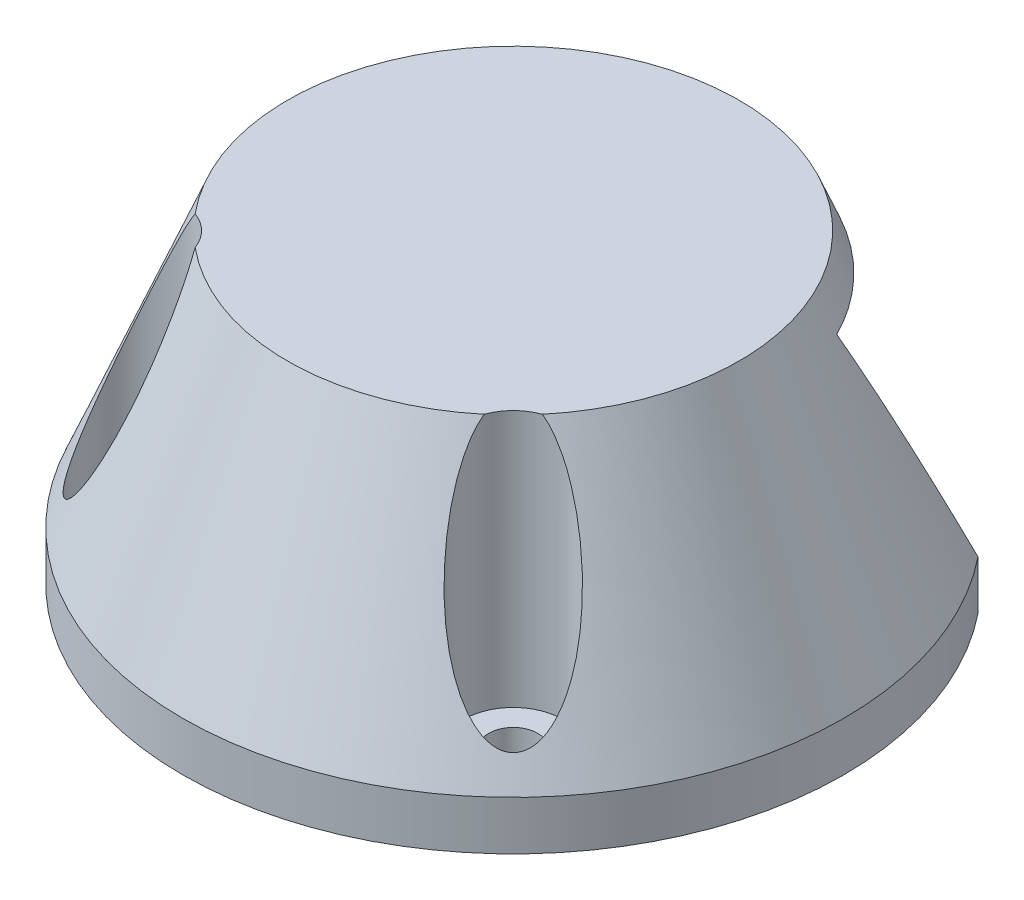
ISO-10303-21;
HEADER;
FILE_DESCRIPTION(('STEP AP214'),'2;1');
FILE_NAME('part.step','',(''),(''),'','','');
FILE_SCHEMA(('AUTOMOTIVE_DESIGN { 1 0 10303 214 1 1 1 1 }'));
ENDSEC;
DATA;
#1=APPLICATION_CONTEXT('core data for automotive mechanical design processes');
#2=APPLICATION_PROTOCOL_DEFINITION('international standard','automotive_design',2000,#1);
#3=PRODUCT_CONTEXT('',#1,'mechanical');
#4=PRODUCT('Part','Part','',(#3));
#5=PRODUCT_RELATED_PRODUCT_CATEGORY('part','',(#4));
#6=PRODUCT_DEFINITION_FORMATION('','',#4);
#7=PRODUCT_DEFINITION_CONTEXT('part definition',#1,'design');
#8=PRODUCT_DEFINITION('design','',#6,#7);
#9=PRODUCT_DEFINITION_SHAPE('','',#8);
#10=(LENGTH_UNIT() NAMED_UNIT(*) SI_UNIT(.MILLI.,.METRE.));
#11=(NAMED_UNIT(*) PLANE_ANGLE_UNIT() SI_UNIT($,.RADIAN.));
#12=(NAMED_UNIT(*) SI_UNIT($,.STERADIAN.) SOLID_ANGLE_UNIT());
#13=UNCERTAINTY_MEASURE_WITH_UNIT(LENGTH_MEASURE(1.E-05),#10,'distance_accuracy_value','');
#14=(GEOMETRIC_REPRESENTATION_CONTEXT(3) GLOBAL_UNCERTAINTY_ASSIGNED_CONTEXT((#13)) GLOBAL_UNIT_ASSIGNED_CONTEXT((#10,
#11,#12)) REPRESENTATION_CONTEXT('',''));
#15=CARTESIAN_POINT('',(0.,0.,0.));
#16=DIRECTION('',(0.,0.,1.));
#17=DIRECTION('',(1.,0.,0.));
#18=AXIS2_PLACEMENT_3D('',#15,#16,#17);
#19=CARTESIAN_POINT('',(0.,0.,0.));
#20=DIRECTION('',(0.,-1.,0.));
#21=DIRECTION('',(0.,0.,-1.));
#22=AXIS2_PLACEMENT_3D('',#19,#20,#21);
#23=PLANE('',#22);
#24=CARTESIAN_POINT('',(0.,0.,0.));
#25=DIRECTION('',(0.,-1.,0.));
#26=DIRECTION('',(0.,0.,-1.));
#27=AXIS2_PLACEMENT_3D('',#24,#25,#26);
#28=CIRCLE('',#27,27.);
#29=CARTESIAN_POINT('',(21.0484004181326,0.,-16.9104949613533));
#30=VERTEX_POINT('',#29);
#31=CARTESIAN_POINT('',(-21.0484004181331,0.,-16.9104949613526));
#32=VERTEX_POINT('',#31);
#33=EDGE_CURVE('E237',#30,#32,#28,.T.);
#34=ORIENTED_EDGE('',*,*,#33,.T.);
#35=DIRECTION('',(-0.397833436870878,0.,-0.917457659245104));
#36=VECTOR('',#35,1.);
#37=CARTESIAN_POINT('',(-16.6806410231171,0.,-6.83785164053032));
#38=LINE('',#37,#36);
#39=CARTESIAN_POINT('',(-16.6806410231171,0.,-6.83785164053032));
#40=VERTEX_POINT('',#39);
#41=EDGE_CURVE('E136',#40,#32,#38,.T.);
#42=ORIENTED_EDGE('',*,*,#41,.F.);
#43=DIRECTION('',(-0.197657340379126,0.,-0.980271174621722));
#44=VECTOR('',#43,1.);
#45=CARTESIAN_POINT('',(-14.7040676193258,0.,2.9648601056869));
#46=LINE('',#45,#44);
#47=CARTESIAN_POINT('',(-14.7040676193258,0.,2.9648601056869));
#48=VERTEX_POINT('',#47);
#49=EDGE_CURVE('E141',#48,#40,#46,.T.);
#50=ORIENTED_EDGE('',*,*,#49,.F.);
#51=CARTESIAN_POINT('',(0.,0.,0.));
#52=DIRECTION('',(0.,-1.,0.));
#53=DIRECTION('',(0.,0.,-1.));
#54=AXIS2_PLACEMENT_3D('',#51,#52,#53);
#55=CIRCLE('',#54,15.);
#56=CARTESIAN_POINT('',(14.7040676193258,0.,2.9648601056869));
#57=VERTEX_POINT('',#56);
#58=EDGE_CURVE('E203',#57,#48,#55,.T.);
#59=ORIENTED_EDGE('',*,*,#58,.F.);
#60=DIRECTION('',(-0.197657340379125,0.,0.980271174621722));
#61=VECTOR('',#60,1.);
#62=CARTESIAN_POINT('',(14.7040676193258,0.,2.9648601056869));
#63=LINE('',#62,#61);
#64=CARTESIAN_POINT('',(16.6806410231171,0.,-6.83785164053032));
#65=VERTEX_POINT('',#64);
#66=EDGE_CURVE('E139',#65,#57,#63,.T.);
#67=ORIENTED_EDGE('',*,*,#66,.F.);
#68=DIRECTION('',(-0.397833436870814,0.,0.917457659245132));
#69=VECTOR('',#68,1.);
#70=CARTESIAN_POINT('',(16.6806410231171,0.,-6.83785164053032));
#71=LINE('',#70,#69);
#72=EDGE_CURVE('E121',#30,#65,#71,.T.);
#73=ORIENTED_EDGE('',*,*,#72,.F.);
#74=EDGE_LOOP('',(#34,#42,#50,#59,#67,#73));
#75=FACE_BOUND('',#74,.T.);
#76=CARTESIAN_POINT('',(15.5563491861042,0.,15.5563491861039));
#77=DIRECTION('',(0.,1.,0.));
#78=DIRECTION('',(0.,0.,1.));
#79=AXIS2_PLACEMENT_3D('',#76,#77,#78);
#80=CIRCLE('',#79,2.);
#81=CARTESIAN_POINT('',(15.5563491861042,0.,17.5563491861039));
#82=VERTEX_POINT('',#81);
#83=EDGE_CURVE('E241',#82,#82,#80,.T.);
#84=ORIENTED_EDGE('',*,*,#83,.T.);
#85=EDGE_LOOP('',(#84));
#86=FACE_BOUND('',#85,.T.);
#87=CARTESIAN_POINT('',(-15.5563491861039,0.,15.5563491861042));
#88=DIRECTION('',(0.,1.,0.));
#89=DIRECTION('',(0.,0.,1.));
#90=AXIS2_PLACEMENT_3D('',#87,#88,#89);
#91=CIRCLE('',#90,2.);
#92=CARTESIAN_POINT('',(-15.5563491861039,0.,17.5563491861042));
#93=VERTEX_POINT('',#92);
#94=EDGE_CURVE('E244',#93,#93,#91,.T.);
#95=ORIENTED_EDGE('',*,*,#94,.T.);
#96=EDGE_LOOP('',(#95));
#97=FACE_BOUND('',#96,.T.);
#98=ADVANCED_FACE('F34',(#75,#86,#97),#23,.T.);
#99=CARTESIAN_POINT('',(0.,0.,0.));
#100=DIRECTION('',(0.,-1.,0.));
#101=DIRECTION('',(0.,0.,-1.));
#102=AXIS2_PLACEMENT_3D('',#99,#100,#101);
#103=CYLINDRICAL_SURFACE('',#102,15.);
#104=ORIENTED_EDGE('',*,*,#58,.T.);
#105=DIRECTION('',(0.,-1.,0.));
#106=VECTOR('',#105,1.);
#107=CARTESIAN_POINT('',(-14.7040676193258,22.,2.9648601056869));
#108=LINE('',#107,#106);
#109=CARTESIAN_POINT('',(-14.7040676193258,22.,2.9648601056869));
#110=VERTEX_POINT('',#109);
#111=EDGE_CURVE('E147',#110,#48,#108,.T.);
#112=ORIENTED_EDGE('',*,*,#111,.F.);
#113=CARTESIAN_POINT('',(0.,22.,0.));
#114=DIRECTION('',(0.,-1.,0.));
#115=DIRECTION('',(0.,0.,-1.));
#116=AXIS2_PLACEMENT_3D('',#113,#114,#115);
#117=CIRCLE('',#116,15.);
#118=CARTESIAN_POINT('',(14.7040676193258,22.,2.9648601056869));
#119=VERTEX_POINT('',#118);
#120=EDGE_CURVE('E258',#119,#110,#117,.T.);
#121=ORIENTED_EDGE('',*,*,#120,.F.);
#122=DIRECTION('',(0.,-1.,0.));
#123=VECTOR('',#122,1.);
#124=CARTESIAN_POINT('',(14.7040676193258,22.,2.9648601056869));
#125=LINE('',#124,#123);
#126=EDGE_CURVE('E124',#119,#57,#125,.T.);
#127=ORIENTED_EDGE('',*,*,#126,.T.);
#128=EDGE_LOOP('',(#104,#112,#121,#127));
#129=FACE_BOUND('',#128,.T.);
#130=ADVANCED_FACE('F227',(#129),#103,.F.);
#131=CARTESIAN_POINT('',(0.,22.,0.));
#132=DIRECTION('',(0.,-1.,0.));
#133=DIRECTION('',(0.,0.,-1.));
#134=AXIS2_PLACEMENT_3D('',#131,#132,#133);
#135=PLANE('',#134);
#136=ORIENTED_EDGE('',*,*,#120,.T.);
#137=DIRECTION('',(-0.197657340379126,0.,-0.980271174621722));
#138=VECTOR('',#137,1.);
#139=CARTESIAN_POINT('',(-14.7040676193258,22.,2.9648601056869));
#140=LINE('',#139,#138);
#141=CARTESIAN_POINT('',(-16.6806410231171,22.,-6.83785164053032));
#142=VERTEX_POINT('',#141);
#143=EDGE_CURVE('E129',#110,#142,#140,.T.);
#144=ORIENTED_EDGE('',*,*,#143,.T.);
#145=DIRECTION('',(-0.397833436870878,0.,-0.917457659245104));
#146=VECTOR('',#145,1.);
#147=CARTESIAN_POINT('',(-16.6806410231171,22.,-6.83785164053032));
#148=LINE('',#147,#146);
#149=CARTESIAN_POINT('',(-17.560126089436,22.,-8.86606303631576));
#150=VERTEX_POINT('',#149);
#151=EDGE_CURVE('E115',#142,#150,#148,.T.);
#152=ORIENTED_EDGE('',*,*,#151,.T.);
#153=CARTESIAN_POINT('',(0.,22.,0.));
#154=DIRECTION('',(0.,-1.,0.));
#155=DIRECTION('',(0.,0.,-1.));
#156=AXIS2_PLACEMENT_3D('',#153,#154,#155);
#157=CIRCLE('',#156,19.6714285714286);
#158=CARTESIAN_POINT('',(17.5601260894359,22.,-8.86606303631594));
#159=VERTEX_POINT('',#158);
#160=EDGE_CURVE('E11',#159,#150,#157,.F.);
#161=ORIENTED_EDGE('',*,*,#160,.F.);
#162=DIRECTION('',(-0.397833436870814,0.,0.917457659245132));
#163=VECTOR('',#162,1.);
#164=CARTESIAN_POINT('',(16.6806410231171,22.,-6.83785164053032));
#165=LINE('',#164,#163);
#166=CARTESIAN_POINT('',(16.6806410231171,22.,-6.83785164053032));
#167=VERTEX_POINT('',#166);
#168=EDGE_CURVE('E105',#159,#167,#165,.T.);
#169=ORIENTED_EDGE('',*,*,#168,.T.);
#170=DIRECTION('',(-0.197657340379125,0.,0.980271174621722));
#171=VECTOR('',#170,1.);
#172=CARTESIAN_POINT('',(14.7040676193258,22.,2.9648601056869));
#173=LINE('',#172,#171);
#174=EDGE_CURVE('E110',#167,#119,#173,.T.);
#175=ORIENTED_EDGE('',*,*,#174,.T.);
#176=EDGE_LOOP('',(#136,#144,#152,#161,#169,#175));
#177=FACE_BOUND('',#176,.T.);
#178=ADVANCED_FACE('F108',(#177),#135,.T.);
#179=CARTESIAN_POINT('',(0.,25.,0.));
#180=DIRECTION('',(0.,-1.,0.));
#181=DIRECTION('',(0.,0.,-1.));
#182=AXIS2_PLACEMENT_3D('',#179,#180,#181);
#183=PLANE('',#182);
#184=CARTESIAN_POINT('',(0.,25.,0.));
#185=DIRECTION('',(0.,-1.,0.));
#186=DIRECTION('',(0.,0.,-1.));
#187=AXIS2_PLACEMENT_3D('',#184,#185,#186);
#188=CIRCLE('',#187,18.45);
#189=CARTESIAN_POINT('',(11.7991895718498,25.,14.1838508680665));
#190=VERTEX_POINT('',#189);
#191=CARTESIAN_POINT('',(-11.7991895718495,25.,14.1838508680668));
#192=VERTEX_POINT('',#191);
#193=EDGE_CURVE('E254',#190,#192,#188,.T.);
#194=ORIENTED_EDGE('',*,*,#193,.F.);
#195=CARTESIAN_POINT('',(15.5563491861042,25.,15.5563491861039));
#196=DIRECTION('',(0.,-1.,0.));
#197=DIRECTION('',(0.,0.,-1.));
#198=AXIS2_PLACEMENT_3D('',#195,#196,#197);
#199=CIRCLE('',#198,4.);
#200=CARTESIAN_POINT('',(14.1838508680668,25.,11.7991895718494));
#201=VERTEX_POINT('',#200);
#202=EDGE_CURVE('E47',#190,#201,#199,.T.);
#203=ORIENTED_EDGE('',*,*,#202,.T.);
#204=CARTESIAN_POINT('',(-14.1838508680666,25.,11.7991895718497));
#205=VERTEX_POINT('',#204);
#206=EDGE_CURVE('E255',#205,#201,#188,.T.);
#207=ORIENTED_EDGE('',*,*,#206,.F.);
#208=CARTESIAN_POINT('',(-15.5563491861039,25.,15.5563491861042));
#209=DIRECTION('',(0.,-1.,0.));
#210=DIRECTION('',(0.,0.,-1.));
#211=AXIS2_PLACEMENT_3D('',#208,#209,#210);
#212=CIRCLE('',#211,4.);
#213=EDGE_CURVE('E54',#205,#192,#212,.T.);
#214=ORIENTED_EDGE('',*,*,#213,.T.);
#215=EDGE_LOOP('',(#194,#203,#207,#214));
#216=FACE_BOUND('',#215,.T.);
#217=ADVANCED_FACE('F224',(#216),#183,.F.);
#218=CARTESIAN_POINT('',(0.,4.,0.));
#219=DIRECTION('',(0.,-1.,0.));
#220=DIRECTION('',(0.,0.,-1.));
#221=AXIS2_PLACEMENT_3D('',#218,#219,#220);
#222=CONICAL_SURFACE('',#221,27.,0.386648806003586);
#223=CARTESIAN_POINT('',(-21.0484370327288,3.9998,-16.9105793995575));
#224=CARTESIAN_POINT('',(-20.90966295222,4.75779050962495,-16.5905476192503));
#225=CARTESIAN_POINT('',(-20.7703541536686,5.51516478625433,-16.2692827068877));
#226=CARTESIAN_POINT('',(-20.4904952904255,7.02846679813618,-15.6238903547277));
#227=CARTESIAN_POINT('',(-20.3499452200931,7.78439452679603,-15.299762901922));
#228=CARTESIAN_POINT('',(-20.0674584628859,9.29444765089693,-14.6483102712092));
#229=CARTESIAN_POINT('',(-19.925522028068,10.048573344041,-14.3209856745794));
#230=CARTESIAN_POINT('',(-19.64002188263,11.5548755147973,-13.662583763448));
#231=CARTESIAN_POINT('',(-19.4964581750168,12.3070519960083,-13.3315064558811));
#232=CARTESIAN_POINT('',(-19.2074277635495,13.8091798065888,-12.6649632742894));
#233=CARTESIAN_POINT('',(-19.0619608838517,14.5591309223794,-12.3294969947457));
#234=CARTESIAN_POINT('',(-18.7688130873676,16.0562869137664,-11.6534585669791));
#235=CARTESIAN_POINT('',(-18.621132192945,16.8034918170074,-11.3128864703301));
#236=CARTESIAN_POINT('',(-18.3231201867635,18.2947267528828,-10.6256305177668));
#237=CARTESIAN_POINT('',(-18.1727886121769,19.0387562023189,-10.2789455945092));
#238=CARTESIAN_POINT('',(-17.9449261005024,20.1517565493493,-9.75346385462612));
#239=CARTESIAN_POINT('',(-17.8685763243704,20.5222560894647,-9.57739095475893));
#240=CARTESIAN_POINT('',(-17.715004877153,21.2621148950918,-9.22323444745489));
#241=CARTESIAN_POINT('',(-17.6377831996562,21.6314741521932,-9.0451508252325));
#242=CARTESIAN_POINT('',(-17.5600839434852,22.0002,-8.86596584205849));
#243=B_SPLINE_CURVE_WITH_KNOTS('',3,(#223,#224,#225,#226,#227,#228,#229,#230,#231,#232,#233,
#234,#235,#236,#237,#238,#239,#240,#241,#242),.UNSPECIFIED.,.F.,.F.,(4,2,2,2,2,2,2,2,2,4),(0.,
2.50321049979108,5.00643238089495,7.50920731908681,10.011977633141,12.5149808469518,
15.0179587949748,17.5213781958486,18.7731335530743,20.024898120904),.UNSPECIFIED.);
#244=CARTESIAN_POINT('',(-21.0484004181331,4.,-16.9104949613526));
#245=VERTEX_POINT('',#244);
#246=EDGE_CURVE('E159',#245,#150,#243,.T.);
#247=ORIENTED_EDGE('',*,*,#246,.F.);
#248=CARTESIAN_POINT('',(0.,4.,0.));
#249=DIRECTION('',(0.,-1.,0.));
#250=DIRECTION('',(0.,0.,-1.));
#251=AXIS2_PLACEMENT_3D('',#248,#249,#250);
#252=CIRCLE('',#251,27.);
#253=CARTESIAN_POINT('',(21.0484004181326,4.,-16.9104949613533));
#254=VERTEX_POINT('',#253);
#255=EDGE_CURVE('E247',#254,#245,#252,.T.);
#256=ORIENTED_EDGE('',*,*,#255,.F.);
#257=CARTESIAN_POINT('',(17.5600839434851,22.0002,-8.86596584205867));
#258=CARTESIAN_POINT('',(17.6377831996561,21.6314741521932,-9.04515082523269));
#259=CARTESIAN_POINT('',(17.7150048771529,21.2621148950918,-9.2232344474551));
#260=CARTESIAN_POINT('',(17.8685763243702,20.5222560894647,-9.57739095475916));
#261=CARTESIAN_POINT('',(17.9449261005023,20.1517565493493,-9.75346385462637));
#262=CARTESIAN_POINT('',(18.1727886121767,19.0387562023189,-10.2789455945095));
#263=CARTESIAN_POINT('',(18.3231201867633,18.2947267528828,-10.6256305177671));
#264=CARTESIAN_POINT('',(18.6211321929448,16.8034918170074,-11.3128864703304));
#265=CARTESIAN_POINT('',(18.7688130873674,16.0562869137664,-11.6534585669795));
#266=CARTESIAN_POINT('',(19.0619608838515,14.5591309223794,-12.3294969947461));
#267=CARTESIAN_POINT('',(19.2074277635492,13.8091798065889,-12.6649632742898));
#268=CARTESIAN_POINT('',(19.4964581750165,12.3070519960083,-13.3315064558816));
#269=CARTESIAN_POINT('',(19.6400218826296,11.5548755147973,-13.6625837634485));
#270=CARTESIAN_POINT('',(19.9255220280676,10.048573344041,-14.3209856745799));
#271=CARTESIAN_POINT('',(20.0674584628855,9.29444765089694,-14.6483102712097));
#272=CARTESIAN_POINT('',(20.3499452200926,7.78439452679604,-15.2997629019226));
#273=CARTESIAN_POINT('',(20.490495290425,7.02846679813619,-15.6238903547283));
#274=CARTESIAN_POINT('',(20.7703541536681,5.51516478625433,-16.2692827068883));
#275=CARTESIAN_POINT('',(20.9096629522195,4.75779050962495,-16.590547619251));
#276=CARTESIAN_POINT('',(21.0484370327283,3.9998,-16.9105793995582));
#277=B_SPLINE_CURVE_WITH_KNOTS('',3,(#257,#258,#259,#260,#261,#262,#263,#264,#265,#266,#267,
#268,#269,#270,#271,#272,#273,#274,#275,#276),.UNSPECIFIED.,.F.,.F.,(4,2,2,2,2,2,2,2,2,4),(0.,
1.25176456782978,2.50351992505549,5.00693932592922,7.50991727395225,10.0129204877631,
12.5156908018173,15.0184657400092,17.5216876211131,20.0248981209042),.UNSPECIFIED.);
#278=EDGE_CURVE('E146',#159,#254,#277,.T.);
#279=ORIENTED_EDGE('',*,*,#278,.F.);
#280=ORIENTED_EDGE('',*,*,#160,.T.);
#281=EDGE_LOOP('',(#247,#256,#279,#280));
#282=FACE_BOUND('',#281,.T.);
#283=CARTESIAN_POINT('',(11.7992451613353,25.0002,14.1836987036192));
#284=CARTESIAN_POINT('',(11.7732096159804,24.9063048770337,14.2550720073797));
#285=CARTESIAN_POINT('',(11.750033358753,24.8103909906954,14.3247051029376));
#286=CARTESIAN_POINT('',(11.7086211531663,24.6154511719495,14.4608464223805));
#287=CARTESIAN_POINT('',(11.6903808197317,24.5164280896312,14.5273573762621));
#288=CARTESIAN_POINT('',(11.6580693996079,24.316339412797,14.6575311463127));
#289=CARTESIAN_POINT('',(11.6439854096075,24.2152812026564,14.7212022448987));
#290=CARTESIAN_POINT('',(11.6193693860191,24.0112991315491,14.8462435781204));
#291=CARTESIAN_POINT('',(11.6088382804854,23.9083747905144,14.9076132078708));
#292=CARTESIAN_POINT('',(11.5820156190691,23.5986876006401,15.087921175562));
#293=CARTESIAN_POINT('',(11.5703079084718,23.3897701649573,15.2038517155131));
#294=CARTESIAN_POINT('',(11.5567791665776,22.9679515417629,15.4292508655593));
#295=CARTESIAN_POINT('',(11.5549691006502,22.7550461979581,15.538712175847));
#296=CARTESIAN_POINT('',(11.5606709464379,22.2399671675766,15.7952277336999));
#297=CARTESIAN_POINT('',(11.5722470895257,21.9364995200214,15.9395908555395));
#298=CARTESIAN_POINT('',(11.6091517784085,21.3262106646868,16.2192853891008));
#299=CARTESIAN_POINT('',(11.6344848925865,21.0193883760894,16.3546137838183));
#300=CARTESIAN_POINT('',(11.6972827148782,20.4033888829505,16.6174168432855));
#301=CARTESIAN_POINT('',(11.7347560097199,20.094210163299,16.744885872936));
#302=CARTESIAN_POINT('',(11.8207792826831,19.4744806579109,16.9925574758051));
#303=CARTESIAN_POINT('',(11.8693299424357,19.1639297888946,17.1127596012883));
#304=CARTESIAN_POINT('',(11.977338818101,18.5392731275369,17.3472981697869));
#305=CARTESIAN_POINT('',(12.0368903959291,18.2251603207743,17.4615727830823));
#306=CARTESIAN_POINT('',(12.1662344255196,17.5966105163026,17.6832209931674));
#307=CARTESIAN_POINT('',(12.2360269265251,17.2821735170419,17.7905945567701));
#308=CARTESIAN_POINT('',(12.3856444464036,16.6536446150488,17.9982740973362));
#309=CARTESIAN_POINT('',(12.4654613611324,16.3395526380034,18.0985856823952));
#310=CARTESIAN_POINT('',(12.6352127854537,15.7118722793522,18.2919498141171));
#311=CARTESIAN_POINT('',(12.7251472048582,15.3982838932825,18.3850024254744));
#312=CARTESIAN_POINT('',(12.9321633761389,14.7166776301403,18.5791299708527));
#313=CARTESIAN_POINT('',(13.0512339275991,14.34883467622,18.6787164260149));
#314=CARTESIAN_POINT('',(13.3043468214304,13.615316487209,18.865920372491));
#315=CARTESIAN_POINT('',(13.4383867247525,13.2496409091697,18.9535398085086));
#316=CARTESIAN_POINT('',(13.721833088544,12.5233127902198,19.1145818838659));
#317=CARTESIAN_POINT('',(13.871156351419,12.1626440417669,19.1880757133304));
#318=CARTESIAN_POINT('',(14.1082618163587,11.6252873476298,19.2860037341394));
#319=CARTESIAN_POINT('',(14.1894725714059,11.4467986549142,19.3165911797996));
#320=CARTESIAN_POINT('',(14.3565551058169,11.0912903749341,19.3731911659521));
#321=CARTESIAN_POINT('',(14.4424264525136,10.9142706530504,19.3992041301698));
#322=CARTESIAN_POINT('',(14.6188583221709,10.5626404528978,19.4460036890678));
#323=CARTESIAN_POINT('',(14.7094018879227,10.3880238246738,19.4668077731247));
#324=CARTESIAN_POINT('',(14.8958281617,10.0410730400722,19.5025781489933));
#325=CARTESIAN_POINT('',(14.9917100917258,9.86873855560848,19.5175452889347));
#326=CARTESIAN_POINT('',(15.1894988381374,9.52662551379025,19.540738490894));
#327=CARTESIAN_POINT('',(15.291417130708,9.35685264855117,19.5489512398668));
#328=CARTESIAN_POINT('',(15.5016804595572,9.02113342269837,19.5573605420593));
#329=CARTESIAN_POINT('',(15.6100239760545,8.85518616999344,19.5575589834182));
#330=CARTESIAN_POINT('',(15.8054401332661,8.56992642571413,19.5494591799629));
#331=CARTESIAN_POINT('',(15.8909292426197,8.4494709911341,19.5433054062154));
#332=CARTESIAN_POINT('',(16.066216997695,8.21225323280948,19.5246998614244));
#333=CARTESIAN_POINT('',(16.1560144419416,8.09548989433855,19.512249837096));
#334=CARTESIAN_POINT('',(16.3400640215586,7.86705593421738,19.4799319928572));
#335=CARTESIAN_POINT('',(16.4343037804008,7.75537269040643,19.4600838279574));
#336=CARTESIAN_POINT('',(16.6277350387377,7.53848865937958,19.4114850703149));
#337=CARTESIAN_POINT('',(16.7269223462421,7.43328254755659,19.3827419102126));
#338=CARTESIAN_POINT('',(16.9289283748027,7.23327781340528,19.3149665962177));
#339=CARTESIAN_POINT('',(17.0316651544275,7.13834122178576,19.2761038593396));
#340=CARTESIAN_POINT('',(17.2420412243401,6.96051530251405,19.1856099847841));
#341=CARTESIAN_POINT('',(17.349678173621,6.87762029981659,19.1339848930377));
#342=CARTESIAN_POINT('',(17.5505982369551,6.74130269544783,19.0253210300522));
#343=CARTESIAN_POINT('',(17.6433232878553,6.68527436443242,18.9705767961161));
#344=CARTESIAN_POINT('',(17.8295486196461,6.5892662561886,18.8494971413936));
#345=CARTESIAN_POINT('',(17.9230472409898,6.5492582932117,18.7831823753109));
#346=CARTESIAN_POINT('',(18.0917128364417,6.49453842102666,18.651715382662));
#347=CARTESIAN_POINT('',(18.1672393825736,6.4766367838877,18.5883676485592));
#348=CARTESIAN_POINT('',(18.3144584755852,6.45615311186836,18.4550848534942));
#349=CARTESIAN_POINT('',(18.3861532916618,6.45356190807128,18.3851537605901));
#350=CARTESIAN_POINT('',(18.5234913527428,6.46394852148876,18.2407482096787));
#351=CARTESIAN_POINT('',(18.5891371733389,6.47691967913807,18.1662757080067));
#352=CARTESIAN_POINT('',(18.7129841576622,6.51717157285719,18.0150559602));
#353=CARTESIAN_POINT('',(18.7711789820672,6.54446439450066,17.9383068445941));
#354=CARTESIAN_POINT('',(18.8985939628475,6.62292063413354,17.7576062400013));
#355=CARTESIAN_POINT('',(18.9645378871457,6.67909638823325,17.6535412514182));
#356=CARTESIAN_POINT('',(19.0828182029454,6.80797541035588,17.4479567791205));
#357=CARTESIAN_POINT('',(19.135123593216,6.88071563993394,17.3464435605554));
#358=CARTESIAN_POINT('',(19.2194436121779,7.0236467143757,17.1656286351299));
#359=CARTESIAN_POINT('',(19.2534191358529,7.09188156650024,17.0856534563513));
#360=CARTESIAN_POINT('',(19.3145620353597,7.23447340018292,16.9285545912445));
#361=CARTESIAN_POINT('',(19.3417247474689,7.30883452948507,16.8514328888898));
#362=CARTESIAN_POINT('',(19.3902055892074,7.46240045132222,16.6999750388894));
#363=CARTESIAN_POINT('',(19.4115125662317,7.54161413990219,16.6256444362487));
#364=CARTESIAN_POINT('',(19.4490213629222,7.70377930253116,16.4798018320397));
#365=CARTESIAN_POINT('',(19.4652211725148,7.78673223362249,16.4082909499181));
#366=CARTESIAN_POINT('',(19.5073468569684,8.04100366309672,16.1969745581704));
#367=CARTESIAN_POINT('',(19.5265384731522,8.21684029729141,16.0612462558083));
#368=CARTESIAN_POINT('',(19.5511213921895,8.57647646714606,15.7993747973811));
#369=CARTESIAN_POINT('',(19.5564986761929,8.7602838994712,15.6732415041993));
#370=CARTESIAN_POINT('',(19.5561933900001,9.13361497875911,15.4294125708531));
#371=CARTESIAN_POINT('',(19.5504996328722,9.32314421690426,15.3117255900189));
#372=CARTESIAN_POINT('',(19.5300118007054,9.70615544826124,15.0840662098486));
#373=CARTESIAN_POINT('',(19.5152209518825,9.89963601665561,14.9740910909544));
#374=CARTESIAN_POINT('',(19.4758146544718,10.3123498813408,14.7486571228299));
#375=CARTESIAN_POINT('',(19.4502552985355,10.5319571413989,14.6340523022206));
#376=CARTESIAN_POINT('',(19.3910703528441,10.974035445972,14.4126546904735));
#377=CARTESIAN_POINT('',(19.3574429385142,11.1965071274851,14.3058636735505));
#378=CARTESIAN_POINT('',(19.2831894717406,11.6438092371916,14.0993988041781));
#379=CARTESIAN_POINT('',(19.2425571026606,11.8686416207757,13.9997314911972));
#380=CARTESIAN_POINT('',(19.1551498021139,12.3200028099264,13.8071159042984));
#381=CARTESIAN_POINT('',(19.1083741611119,12.5465318085943,13.7141684084312));
#382=CARTESIAN_POINT('',(19.0089872906425,13.0024817424006,13.5339865669017));
#383=CARTESIAN_POINT('',(18.9563375507747,13.2319118236746,13.4467967044846));
#384=CARTESIAN_POINT('',(18.8459823558501,13.6918044994744,13.2785375701584));
#385=CARTESIAN_POINT('',(18.7882764930036,13.9222671758567,13.1974687929143));
#386=CARTESIAN_POINT('',(18.6082870227251,14.6145117889351,12.9631802170088));
#387=CARTESIAN_POINT('',(18.4790533363066,15.0775035812807,12.8187396990053));
#388=CARTESIAN_POINT('',(18.2427656558995,15.8750664701294,12.5895149458553));
#389=CARTESIAN_POINT('',(18.1396358611005,16.2092900467992,12.4993521847752));
#390=CARTESIAN_POINT('',(17.9253389236174,16.8780921166863,12.3304361660825));
#391=CARTESIAN_POINT('',(17.8141710977829,17.2126706376836,12.2516838799561));
#392=CARTESIAN_POINT('',(17.5838331170707,17.8821821636848,12.1055608523252));
#393=CARTESIAN_POINT('',(17.4646503807956,18.217114873488,12.0382086176379));
#394=CARTESIAN_POINT('',(17.218388936302,18.8862326467258,11.9153930560986));
#395=CARTESIAN_POINT('',(17.0913109453599,19.2204177752279,11.8599286512798));
#396=CARTESIAN_POINT('',(16.8306382635061,19.8829448944558,11.7622348154352));
#397=CARTESIAN_POINT('',(16.697153224021,20.211305330107,11.7198385761983));
#398=CARTESIAN_POINT('',(16.4214221685782,20.8658056653979,11.6484129228794));
#399=CARTESIAN_POINT('',(16.2791771693851,21.191945817883,11.6193819607985));
#400=CARTESIAN_POINT('',(16.0584414966501,21.6781447278184,11.5872948441984));
#401=CARTESIAN_POINT('',(15.9837137917551,21.8395482522746,11.5785121214384));
#402=CARTESIAN_POINT('',(15.8315196681955,22.1612278053611,11.565093174999));
#403=CARTESIAN_POINT('',(15.7540534431612,22.3215039127499,11.5604566587643));
#404=CARTESIAN_POINT('',(15.5961302329798,22.6405287263017,11.5557674445844));
#405=CARTESIAN_POINT('',(15.5156750940384,22.7992783015252,11.555711962598));
#406=CARTESIAN_POINT('',(15.3513482282349,23.1149050819001,11.5607595635036));
#407=CARTESIAN_POINT('',(15.2674769420131,23.271782525179,11.5658619831008));
#408=CARTESIAN_POINT('',(15.1062533092236,23.5641040150254,11.5810321737928));
#409=CARTESIAN_POINT('',(15.0293518464494,23.6998305626715,11.5904191839307));
#410=CARTESIAN_POINT('',(14.8720912965681,23.968704935979,11.6145070131976));
#411=CARTESIAN_POINT('',(14.7917340595938,24.1018540874786,11.6292050194025));
#412=CARTESIAN_POINT('',(14.6264880620087,24.3654663734694,11.6650056115732));
#413=CARTESIAN_POINT('',(14.5415778170482,24.4959118374268,11.6861412617976));
#414=CARTESIAN_POINT('',(14.4104551364671,24.688025464518,11.7237268966802));
#415=CARTESIAN_POINT('',(14.3660816587519,24.7515238752524,11.7372499396081));
#416=CARTESIAN_POINT('',(14.27595484028,24.8770441544378,11.7665175016878));
#417=CARTESIAN_POINT('',(14.2302010109074,24.939065485796,11.7822628149071));
#418=CARTESIAN_POINT('',(14.183698703621,25.0002000000009,11.7992451613332));
#419=B_SPLINE_CURVE_WITH_KNOTS('',3,(#283,#284,#285,#286,#287,#288,#289,#290,#291,#292,#293,
#294,#295,#296,#297,#298,#299,#300,#301,#302,#303,#304,#305,#306,#307,#308,#309,#310,#311,#312,
#313,#314,#315,#316,#317,#318,#319,#320,#321,#322,#323,#324,#325,#326,#327,#328,#329,#330,#331,
#332,#333,#334,#335,#336,#337,#338,#339,#340,#341,#342,#343,#344,#345,#346,#347,#348,#349,#350,
#351,#352,#353,#354,#355,#356,#357,#358,#359,#360,#361,#362,#363,#364,#365,#366,#367,#368,#369,
#370,#371,#372,#373,#374,#375,#376,#377,#378,#379,#380,#381,#382,#383,#384,#385,#386,#387,#388,
#389,#390,#391,#392,#393,#394,#395,#396,#397,#398,#399,#400,#401,#402,#403,#404,#405,#406,#407,
#408,#409,#410,#411,#412,#413,#414,#415,#416,#417,#418),.UNSPECIFIED.,.F.,.F.,(4,2,2,2,2,2,2,2,
2,2,2,2,2,2,2,2,2,2,2,2,2,2,2,2,2,2,2,2,2,2,2,2,2,2,2,2,2,2,2,2,2,2,2,2,2,2,2,2,2,2,2,2,2,2,2,2,
2,2,2,2,2,2,2,2,2,2,2,4),(0.,0.362173800626449,0.724024781721419,1.08474028974462,
1.44554994797923,2.16272671250213,2.88069785969071,3.8889104703289,4.89745809079357,
5.90672061828648,6.91604526617023,7.93436600532563,8.95269164119999,9.97019925748703,
10.9876978043538,12.1850150178176,13.3821374288266,14.5730585874048,15.1683677711375,
15.7636217834385,16.3568495236569,16.9499910335186,17.5442988545913,18.1384666582678,
18.5817784403776,19.0249673056816,19.4669870254001,19.9086383870876,20.3433244585639,
20.7778049987974,21.140677819275,21.5029093773034,21.8021287045586,22.1011688209896,
22.4000810155069,22.6992458586469,23.1031811248285,23.5080267107024,23.8390124203607,
24.1702240922664,24.5020622730577,24.8340308957881,25.5017515824508,26.1701496080623,
26.8392233794289,27.5080600054618,28.2548251769092,29.0017593872243,29.7493706938381,
30.4970684240684,31.2499932972617,32.002978951829,33.507789923212,34.5911761190248,
35.6746545000426,36.7598752694759,37.8449975913893,38.9156329472294,39.98614426826,
40.5203260370198,41.0544701110734,41.5882895662963,42.1220403822238,42.5907558020296,
43.0592233336992,43.5301387276888,43.7660016037979,44.0019489734128),.UNSPECIFIED.);
#420=EDGE_CURVE('E41',#190,#201,#419,.T.);
#421=ORIENTED_EDGE('',*,*,#420,.F.);
#422=ORIENTED_EDGE('',*,*,#193,.T.);
#423=CARTESIAN_POINT('',(-14.1836987036193,25.0002,11.7992451613353));
#424=CARTESIAN_POINT('',(-14.2550720073798,24.9063048770337,11.7732096159803));
#425=CARTESIAN_POINT('',(-14.3247051029377,24.8103909906954,11.750033358753));
#426=CARTESIAN_POINT('',(-14.4608464223805,24.6154511719495,11.7086211531663));
#427=CARTESIAN_POINT('',(-14.5273573762621,24.5164280896312,11.6903808197316));
#428=CARTESIAN_POINT('',(-14.6575311463128,24.316339412797,11.6580693996079));
#429=CARTESIAN_POINT('',(-14.7212022448988,24.2152812026564,11.6439854096075));
#430=CARTESIAN_POINT('',(-14.8462435781204,24.0112991315491,11.6193693860191));
#431=CARTESIAN_POINT('',(-14.9076132078708,23.9083747905144,11.6088382804854));
#432=CARTESIAN_POINT('',(-15.0879211755621,23.5986876006401,11.5820156190691));
#433=CARTESIAN_POINT('',(-15.2038517155131,23.3897701649573,11.5703079084718));
#434=CARTESIAN_POINT('',(-15.4292508655594,22.9679515417629,11.5567791665775));
#435=CARTESIAN_POINT('',(-15.538712175847,22.7550461979581,11.5549691006501));
#436=CARTESIAN_POINT('',(-15.7952277337,22.2399671675766,11.5606709464378));
#437=CARTESIAN_POINT('',(-15.9395908555395,21.9364995200214,11.5722470895256));
#438=CARTESIAN_POINT('',(-16.2192853891008,21.3262106646868,11.6091517784084));
#439=CARTESIAN_POINT('',(-16.3546137838183,21.0193883760894,11.6344848925864));
#440=CARTESIAN_POINT('',(-16.6174168432855,20.4033888829505,11.6972827148782));
#441=CARTESIAN_POINT('',(-16.744885872936,20.094210163299,11.7347560097198));
#442=CARTESIAN_POINT('',(-16.9925574758051,19.474480657911,11.820779282683));
#443=CARTESIAN_POINT('',(-17.1127596012883,19.1639297888946,11.8693299424356));
#444=CARTESIAN_POINT('',(-17.347298169787,18.5392731275369,11.977338818101));
#445=CARTESIAN_POINT('',(-17.4615727830824,18.2251603207743,12.036890395929));
#446=CARTESIAN_POINT('',(-17.6832209931674,17.5966105163026,12.1662344255195));
#447=CARTESIAN_POINT('',(-17.7905945567701,17.2821735170419,12.236026926525));
#448=CARTESIAN_POINT('',(-17.9982740973362,16.6536446150488,12.3856444464035));
#449=CARTESIAN_POINT('',(-18.0985856823953,16.3395526380035,12.4654613611323));
#450=CARTESIAN_POINT('',(-18.2919498141171,15.7118722793522,12.6352127854537));
#451=CARTESIAN_POINT('',(-18.3850024254744,15.3982838932825,12.7251472048581));
#452=CARTESIAN_POINT('',(-18.5791299708527,14.7166776301403,12.9321633761388));
#453=CARTESIAN_POINT('',(-18.6787164260149,14.34883467622,13.051233927599));
#454=CARTESIAN_POINT('',(-18.8659203724911,13.6153164872091,13.3043468214303));
#455=CARTESIAN_POINT('',(-18.9535398085087,13.2496409091697,13.4383867247524));
#456=CARTESIAN_POINT('',(-19.114581883866,12.5233127902198,13.721833088544));
#457=CARTESIAN_POINT('',(-19.1880757133304,12.1626440417669,13.871156351419));
#458=CARTESIAN_POINT('',(-19.2860037341394,11.6252873476298,14.1082618163586));
#459=CARTESIAN_POINT('',(-19.3165911797996,11.4467986549142,14.1894725714059));
#460=CARTESIAN_POINT('',(-19.3731911659521,11.0912903749341,14.3565551058169));
#461=CARTESIAN_POINT('',(-19.3992041301698,10.9142706530504,14.4424264525136));
#462=CARTESIAN_POINT('',(-19.4460036890678,10.5626404528978,14.6188583221709));
#463=CARTESIAN_POINT('',(-19.4668077731248,10.3880238246738,14.7094018879227));
#464=CARTESIAN_POINT('',(-19.5025781489933,10.0410730400722,14.8958281617));
#465=CARTESIAN_POINT('',(-19.5175452889347,9.86873855560848,14.9917100917258));
#466=CARTESIAN_POINT('',(-19.540738490894,9.52662551379027,15.1894988381373));
#467=CARTESIAN_POINT('',(-19.5489512398668,9.35685264855118,15.2914171307079));
#468=CARTESIAN_POINT('',(-19.5573605420593,9.02113342269839,15.5016804595572));
#469=CARTESIAN_POINT('',(-19.5575589834183,8.85518616999346,15.6100239760544));
#470=CARTESIAN_POINT('',(-19.5494591799629,8.56992642571415,15.805440133266));
#471=CARTESIAN_POINT('',(-19.5433054062155,8.44947099113413,15.8909292426197));
#472=CARTESIAN_POINT('',(-19.5246998614244,8.2122532328095,16.0662169976949));
#473=CARTESIAN_POINT('',(-19.512249837096,8.09548989433856,16.1560144419415));
#474=CARTESIAN_POINT('',(-19.4799319928573,7.86705593421738,16.3400640215585));
#475=CARTESIAN_POINT('',(-19.4600838279575,7.75537269040643,16.4343037804007));
#476=CARTESIAN_POINT('',(-19.4114850703149,7.53848865937957,16.6277350387377));
#477=CARTESIAN_POINT('',(-19.3827419102126,7.43328254755658,16.726922346242));
#478=CARTESIAN_POINT('',(-19.3149665962177,7.23327781340527,16.9289283748027));
#479=CARTESIAN_POINT('',(-19.2761038593396,7.13834122178575,17.0316651544274));
#480=CARTESIAN_POINT('',(-19.1856099847841,6.96051530251405,17.24204122434));
#481=CARTESIAN_POINT('',(-19.1339848930377,6.87762029981659,17.3496781736209));
#482=CARTESIAN_POINT('',(-19.0253210300523,6.74130269544783,17.5505982369551));
#483=CARTESIAN_POINT('',(-18.9705767961162,6.68527436443242,17.6433232878553));
#484=CARTESIAN_POINT('',(-18.8494971413937,6.5892662561886,17.8295486196461));
#485=CARTESIAN_POINT('',(-18.7831823753109,6.5492582932117,17.9230472409897));
#486=CARTESIAN_POINT('',(-18.6517153826621,6.49453842102666,18.0917128364416));
#487=CARTESIAN_POINT('',(-18.5883676485592,6.4766367838877,18.1672393825735));
#488=CARTESIAN_POINT('',(-18.4550848534942,6.45615311186836,18.3144584755851));
#489=CARTESIAN_POINT('',(-18.3851537605902,6.45356190807127,18.3861532916618));
#490=CARTESIAN_POINT('',(-18.2407482096788,6.46394852148875,18.5234913527427));
#491=CARTESIAN_POINT('',(-18.1662757080067,6.47691967913807,18.5891371733389));
#492=CARTESIAN_POINT('',(-18.0150559602001,6.51717157285718,18.7129841576621));
#493=CARTESIAN_POINT('',(-17.9383068445942,6.54446439450065,18.7711789820672));
#494=CARTESIAN_POINT('',(-17.7576062400014,6.62292063413353,18.8985939628474));
#495=CARTESIAN_POINT('',(-17.6535412514183,6.67909638823324,18.9645378871457));
#496=CARTESIAN_POINT('',(-17.4479567791206,6.80797541035587,19.0828182029454));
#497=CARTESIAN_POINT('',(-17.3464435605555,6.88071563993393,19.1351235932159));
#498=CARTESIAN_POINT('',(-17.16562863513,7.02364671437568,19.2194436121779));
#499=CARTESIAN_POINT('',(-17.0856534563513,7.09188156650022,19.2534191358528));
#500=CARTESIAN_POINT('',(-16.9285545912445,7.2344734001829,19.3145620353596));
#501=CARTESIAN_POINT('',(-16.8514328888899,7.30883452948505,19.3417247474688));
#502=CARTESIAN_POINT('',(-16.6999750388894,7.4624004513222,19.3902055892073));
#503=CARTESIAN_POINT('',(-16.6256444362487,7.54161413990217,19.4115125662317));
#504=CARTESIAN_POINT('',(-16.4798018320398,7.70377930253114,19.4490213629222));
#505=CARTESIAN_POINT('',(-16.4082909499182,7.78673223362247,19.4652211725148));
#506=CARTESIAN_POINT('',(-16.1969745581704,8.04100366309669,19.5073468569683));
#507=CARTESIAN_POINT('',(-16.0612462558084,8.21684029729138,19.5265384731521));
#508=CARTESIAN_POINT('',(-15.7993747973812,8.57647646714602,19.5511213921894));
#509=CARTESIAN_POINT('',(-15.6732415041994,8.76028389947116,19.5564986761928));
#510=CARTESIAN_POINT('',(-15.4294125708531,9.13361497875906,19.5561933900001));
#511=CARTESIAN_POINT('',(-15.311725590019,9.3231442169042,19.5504996328721));
#512=CARTESIAN_POINT('',(-15.0840662098487,9.70615544826118,19.5300118007053));
#513=CARTESIAN_POINT('',(-14.9740910909545,9.89963601665555,19.5152209518825));
#514=CARTESIAN_POINT('',(-14.74865712283,10.3123498813408,19.4758146544718));
#515=CARTESIAN_POINT('',(-14.6340523022207,10.5319571413988,19.4502552985354));
#516=CARTESIAN_POINT('',(-14.4126546904736,10.974035445972,19.3910703528441));
#517=CARTESIAN_POINT('',(-14.3058636735506,11.196507127485,19.3574429385141));
#518=CARTESIAN_POINT('',(-14.0993988041782,11.6438092371915,19.2831894717406));
#519=CARTESIAN_POINT('',(-13.9997314911973,11.8686416207756,19.2425571026606));
#520=CARTESIAN_POINT('',(-13.8071159042986,12.3200028099263,19.1551498021138));
#521=CARTESIAN_POINT('',(-13.7141684084313,12.5465318085942,19.1083741611119));
#522=CARTESIAN_POINT('',(-13.5339865669018,13.0024817424005,19.0089872906425));
#523=CARTESIAN_POINT('',(-13.4467967044848,13.2319118236745,18.9563375507747));
#524=CARTESIAN_POINT('',(-13.2785375701585,13.6918044994742,18.8459823558501));
#525=CARTESIAN_POINT('',(-13.1974687929144,13.9222671758566,18.7882764930035));
#526=CARTESIAN_POINT('',(-12.9631802170089,14.6145117889349,18.6082870227251));
#527=CARTESIAN_POINT('',(-12.8187396990054,15.0775035812806,18.4790533363066));
#528=CARTESIAN_POINT('',(-12.5895149458554,15.8750664701293,18.2427656558995));
#529=CARTESIAN_POINT('',(-12.4993521847753,16.209290046799,18.1396358611005));
#530=CARTESIAN_POINT('',(-12.3304361660826,16.8780921166861,17.9253389236174));
#531=CARTESIAN_POINT('',(-12.2516838799561,17.2126706376835,17.8141710977829));
#532=CARTESIAN_POINT('',(-12.1055608523253,17.8821821636847,17.5838331170707));
#533=CARTESIAN_POINT('',(-12.038208617638,18.2171148734879,17.4646503807956));
#534=CARTESIAN_POINT('',(-11.9153930560987,18.8862326467257,17.218388936302));
#535=CARTESIAN_POINT('',(-11.8599286512799,19.2204177752278,17.0913109453599));
#536=CARTESIAN_POINT('',(-11.7622348154352,19.8829448944557,16.830638263506));
#537=CARTESIAN_POINT('',(-11.7198385761983,20.2113053301069,16.697153224021));
#538=CARTESIAN_POINT('',(-11.6484129228795,20.8658056653978,16.4214221685782));
#539=CARTESIAN_POINT('',(-11.6193819607986,21.1919458178829,16.2791771693851));
#540=CARTESIAN_POINT('',(-11.5872948441985,21.6781447278184,16.05844149665));
#541=CARTESIAN_POINT('',(-11.5785121214384,21.8395482522746,15.9837137917551));
#542=CARTESIAN_POINT('',(-11.565093174999,22.1612278053611,15.8315196681955));
#543=CARTESIAN_POINT('',(-11.5604566587644,22.3215039127498,15.7540534431612));
#544=CARTESIAN_POINT('',(-11.5557674445844,22.6405287263016,15.5961302329798));
#545=CARTESIAN_POINT('',(-11.555711962598,22.7992783015252,15.5156750940383));
#546=CARTESIAN_POINT('',(-11.5607595635037,23.1149050819001,15.3513482282349));
#547=CARTESIAN_POINT('',(-11.5658619831008,23.271782525179,15.2674769420131));
#548=CARTESIAN_POINT('',(-11.5810321737928,23.5641040150254,15.1062533092236));
#549=CARTESIAN_POINT('',(-11.5904191839308,23.6998305626715,15.0293518464494));
#550=CARTESIAN_POINT('',(-11.6145070131976,23.968704935979,14.8720912965681));
#551=CARTESIAN_POINT('',(-11.6292050194026,24.1018540874786,14.7917340595938));
#552=CARTESIAN_POINT('',(-11.6650056115732,24.3654663734694,14.6264880620087));
#553=CARTESIAN_POINT('',(-11.6861412617976,24.4959118374268,14.5415778170481));
#554=CARTESIAN_POINT('',(-11.7237268966802,24.688025464518,14.4104551364671));
#555=CARTESIAN_POINT('',(-11.7372499396081,24.7515238752524,14.3660816587518));
#556=CARTESIAN_POINT('',(-11.7665175016879,24.8770441544378,14.2759548402799));
#557=CARTESIAN_POINT('',(-11.7822628149071,24.939065485796,14.2302010109074));
#558=CARTESIAN_POINT('',(-11.7992451613333,25.0002000000009,14.1836987036209));
#559=B_SPLINE_CURVE_WITH_KNOTS('',3,(#423,#424,#425,#426,#427,#428,#429,#430,#431,#432,#433,
#434,#435,#436,#437,#438,#439,#440,#441,#442,#443,#444,#445,#446,#447,#448,#449,#450,#451,#452,
#453,#454,#455,#456,#457,#458,#459,#460,#461,#462,#463,#464,#465,#466,#467,#468,#469,#470,#471,
#472,#473,#474,#475,#476,#477,#478,#479,#480,#481,#482,#483,#484,#485,#486,#487,#488,#489,#490,
#491,#492,#493,#494,#495,#496,#497,#498,#499,#500,#501,#502,#503,#504,#505,#506,#507,#508,#509,
#510,#511,#512,#513,#514,#515,#516,#517,#518,#519,#520,#521,#522,#523,#524,#525,#526,#527,#528,
#529,#530,#531,#532,#533,#534,#535,#536,#537,#538,#539,#540,#541,#542,#543,#544,#545,#546,#547,
#548,#549,#550,#551,#552,#553,#554,#555,#556,#557,#558),.UNSPECIFIED.,.F.,.F.,(4,2,2,2,2,2,2,2,
2,2,2,2,2,2,2,2,2,2,2,2,2,2,2,2,2,2,2,2,2,2,2,2,2,2,2,2,2,2,2,2,2,2,2,2,2,2,2,2,2,2,2,2,2,2,2,2,
2,2,2,2,2,2,2,2,2,2,2,4),(0.,0.36217380062645,0.72402478172142,1.08474028974462,
1.44554994797923,2.16272671250212,2.8806978596907,3.88891047032889,4.89745809079356,
5.90672061828646,6.91604526617021,7.93436600532561,8.95269164119996,9.970199257487,
10.9876978043538,12.1850150178176,13.3821374288266,14.5730585874048,15.1683677711375,
15.7636217834385,16.3568495236569,16.9499910335186,17.5442988545913,18.1384666582678,
18.5817784403776,19.0249673056816,19.4669870254001,19.9086383870877,20.3433244585639,
20.7778049987974,21.140677819275,21.5029093773034,21.8021287045586,22.1011688209896,
22.4000810155069,22.6992458586468,23.1031811248285,23.5080267107024,23.8390124203607,
24.1702240922664,24.5020622730577,24.834030895788,25.5017515824507,26.1701496080622,
26.8392233794289,27.5080600054618,28.2548251769092,29.0017593872243,29.749370693838,
30.4970684240682,31.2499932972616,32.0029789518289,33.5077899232119,34.5911761190246,
35.6746545000425,36.7598752694757,37.8449975913892,38.9156329472293,39.98614426826,
40.5203260370197,41.0544701110734,41.5882895662963,42.1220403822237,42.5907558020295,
43.0592233336992,43.5301387276888,43.7660016037979,44.0019489734128),.UNSPECIFIED.);
#560=EDGE_CURVE('E194',#205,#192,#559,.T.);
#561=ORIENTED_EDGE('',*,*,#560,.F.);
#562=ORIENTED_EDGE('',*,*,#206,.T.);
#563=EDGE_LOOP('',(#421,#422,#561,#562));
#564=FACE_BOUND('',#563,.T.);
#565=ADVANCED_FACE('F165',(#282,#564),#222,.T.);
#566=CARTESIAN_POINT('',(0.,0.,0.));
#567=DIRECTION('',(0.,-1.,0.));
#568=DIRECTION('',(0.,0.,-1.));
#569=AXIS2_PLACEMENT_3D('',#566,#567,#568);
#570=CYLINDRICAL_SURFACE('',#569,27.);
#571=DIRECTION('',(0.,-1.,0.));
#572=VECTOR('',#571,1.);
#573=CARTESIAN_POINT('',(-21.0484004181331,22.,-16.9104949613526));
#574=LINE('',#573,#572);
#575=EDGE_CURVE('E132',#245,#32,#574,.T.);
#576=ORIENTED_EDGE('',*,*,#575,.T.);
#577=ORIENTED_EDGE('',*,*,#33,.F.);
#578=DIRECTION('',(0.,-1.,0.));
#579=VECTOR('',#578,1.);
#580=CARTESIAN_POINT('',(21.0484004181326,22.,-16.9104949613533));
#581=LINE('',#580,#579);
#582=EDGE_CURVE('E125',#254,#30,#581,.T.);
#583=ORIENTED_EDGE('',*,*,#582,.F.);
#584=ORIENTED_EDGE('',*,*,#255,.T.);
#585=EDGE_LOOP('',(#576,#577,#583,#584));
#586=FACE_BOUND('',#585,.T.);
#587=ADVANCED_FACE('F217',(#586),#570,.T.);
#588=CARTESIAN_POINT('',(-15.5563491861039,0.,15.5563491861042));
#589=DIRECTION('',(0.,1.,0.));
#590=DIRECTION('',(0.,0.,1.));
#591=AXIS2_PLACEMENT_3D('',#588,#589,#590);
#592=CYLINDRICAL_SURFACE('',#591,2.);
#593=CARTESIAN_POINT('',(-15.5563491861039,4.,15.5563491861042));
#594=DIRECTION('',(0.,-1.,0.));
#595=DIRECTION('',(0.,0.,-1.));
#596=AXIS2_PLACEMENT_3D('',#593,#594,#595);
#597=CIRCLE('',#596,2.);
#598=CARTESIAN_POINT('',(-15.5563491861039,4.,13.5563491861042));
#599=VERTEX_POINT('',#598);
#600=EDGE_CURVE('E204',#599,#599,#597,.F.);
#601=ORIENTED_EDGE('',*,*,#600,.T.);
#602=EDGE_LOOP('',(#601));
#603=FACE_BOUND('',#602,.T.);
#604=ORIENTED_EDGE('',*,*,#94,.F.);
#605=EDGE_LOOP('',(#604));
#606=FACE_BOUND('',#605,.T.);
#607=ADVANCED_FACE('F214',(#603,#606),#592,.F.);
#608=CARTESIAN_POINT('',(15.5563491861042,0.,15.5563491861039));
#609=DIRECTION('',(0.,1.,0.));
#610=DIRECTION('',(0.,0.,1.));
#611=AXIS2_PLACEMENT_3D('',#608,#609,#610);
#612=CYLINDRICAL_SURFACE('',#611,2.);
#613=CARTESIAN_POINT('',(15.5563491861042,4.,15.5563491861039));
#614=DIRECTION('',(0.,-1.,0.));
#615=DIRECTION('',(0.,0.,-1.));
#616=AXIS2_PLACEMENT_3D('',#613,#614,#615);
#617=CIRCLE('',#616,2.);
#618=CARTESIAN_POINT('',(15.5563491861042,4.,13.5563491861039));
#619=VERTEX_POINT('',#618);
#620=EDGE_CURVE('E195',#619,#619,#617,.F.);
#621=ORIENTED_EDGE('',*,*,#620,.T.);
#622=EDGE_LOOP('',(#621));
#623=FACE_BOUND('',#622,.T.);
#624=ORIENTED_EDGE('',*,*,#83,.F.);
#625=EDGE_LOOP('',(#624));
#626=FACE_BOUND('',#625,.T.);
#627=ADVANCED_FACE('F210',(#623,#626),#612,.F.);
#628=CARTESIAN_POINT('',(-15.5563491861039,26.,15.5563491861042));
#629=DIRECTION('',(0.,-1.,0.));
#630=DIRECTION('',(0.,0.,-1.));
#631=AXIS2_PLACEMENT_3D('',#628,#629,#630);
#632=CYLINDRICAL_SURFACE('',#631,4.);
#633=CARTESIAN_POINT('',(-15.5563491861039,4.,15.5563491861042));
#634=DIRECTION('',(0.,-1.,0.));
#635=DIRECTION('',(0.,0.,-1.));
#636=AXIS2_PLACEMENT_3D('',#633,#634,#635);
#637=CIRCLE('',#636,4.);
#638=CARTESIAN_POINT('',(-15.5563491861039,4.,11.5563491861042));
#639=VERTEX_POINT('',#638);
#640=EDGE_CURVE('E273',#639,#639,#637,.T.);
#641=ORIENTED_EDGE('',*,*,#640,.T.);
#642=EDGE_LOOP('',(#641));
#643=FACE_BOUND('',#642,.T.);
#644=ORIENTED_EDGE('',*,*,#560,.T.);
#645=ORIENTED_EDGE('',*,*,#213,.F.);
#646=EDGE_LOOP('',(#644,#645));
#647=FACE_BOUND('',#646,.T.);
#648=ADVANCED_FACE('F206',(#643,#647),#632,.F.);
#649=CARTESIAN_POINT('',(-15.5563491861039,4.,15.5563491861042));
#650=DIRECTION('',(0.,-1.,0.));
#651=DIRECTION('',(0.,0.,-1.));
#652=AXIS2_PLACEMENT_3D('',#649,#650,#651);
#653=PLANE('',#652);
#654=ORIENTED_EDGE('',*,*,#640,.F.);
#655=EDGE_LOOP('',(#654));
#656=FACE_BOUND('',#655,.T.);
#657=ORIENTED_EDGE('',*,*,#600,.F.);
#658=EDGE_LOOP('',(#657));
#659=FACE_BOUND('',#658,.T.);
#660=ADVANCED_FACE('F187',(#656,#659),#653,.F.);
#661=CARTESIAN_POINT('',(15.5563491861042,26.,15.5563491861039));
#662=DIRECTION('',(0.,-1.,0.));
#663=DIRECTION('',(0.,0.,-1.));
#664=AXIS2_PLACEMENT_3D('',#661,#662,#663);
#665=CYLINDRICAL_SURFACE('',#664,4.);
#666=CARTESIAN_POINT('',(15.5563491861042,4.,15.5563491861039));
#667=DIRECTION('',(0.,-1.,0.));
#668=DIRECTION('',(0.,0.,-1.));
#669=AXIS2_PLACEMENT_3D('',#666,#667,#668);
#670=CIRCLE('',#669,4.);
#671=CARTESIAN_POINT('',(15.5563491861042,4.,11.5563491861039));
#672=VERTEX_POINT('',#671);
#673=EDGE_CURVE('E198',#672,#672,#670,.T.);
#674=ORIENTED_EDGE('',*,*,#673,.T.);
#675=EDGE_LOOP('',(#674));
#676=FACE_BOUND('',#675,.T.);
#677=ORIENTED_EDGE('',*,*,#420,.T.);
#678=ORIENTED_EDGE('',*,*,#202,.F.);
#679=EDGE_LOOP('',(#677,#678));
#680=FACE_BOUND('',#679,.T.);
#681=ADVANCED_FACE('F182',(#676,#680),#665,.F.);
#682=CARTESIAN_POINT('',(15.5563491861042,4.,15.5563491861039));
#683=DIRECTION('',(0.,-1.,0.));
#684=DIRECTION('',(0.,0.,-1.));
#685=AXIS2_PLACEMENT_3D('',#682,#683,#684);
#686=PLANE('',#685);
#687=ORIENTED_EDGE('',*,*,#673,.F.);
#688=EDGE_LOOP('',(#687));
#689=FACE_BOUND('',#688,.T.);
#690=ORIENTED_EDGE('',*,*,#620,.F.);
#691=EDGE_LOOP('',(#690));
#692=FACE_BOUND('',#691,.T.);
#693=ADVANCED_FACE('F178',(#689,#692),#686,.F.);
#694=CARTESIAN_POINT('',(-16.6806410231171,22.,-6.83785164053032));
#695=DIRECTION('',(-0.917457659245104,0.,0.397833436870878));
#696=DIRECTION('',(0.397833436870878,0.,0.917457659245104));
#697=AXIS2_PLACEMENT_3D('',#694,#695,#696);
#698=PLANE('',#697);
#699=ORIENTED_EDGE('',*,*,#246,.T.);
#700=ORIENTED_EDGE('',*,*,#151,.F.);
#701=DIRECTION('',(0.,-1.,0.));
#702=VECTOR('',#701,1.);
#703=CARTESIAN_POINT('',(-16.6806410231171,22.,-6.83785164053032));
#704=LINE('',#703,#702);
#705=EDGE_CURVE('E144',#142,#40,#704,.T.);
#706=ORIENTED_EDGE('',*,*,#705,.T.);
#707=ORIENTED_EDGE('',*,*,#41,.T.);
#708=ORIENTED_EDGE('',*,*,#575,.F.);
#709=EDGE_LOOP('',(#699,#700,#706,#707,#708));
#710=FACE_BOUND('',#709,.T.);
#711=ADVANCED_FACE('F173',(#710),#698,.F.);
#712=CARTESIAN_POINT('',(16.6806410231171,22.,-6.83785164053032));
#713=DIRECTION('',(0.917457659245132,0.,0.397833436870814));
#714=DIRECTION('',(0.397833436870814,0.,-0.917457659245132));
#715=AXIS2_PLACEMENT_3D('',#712,#713,#714);
#716=PLANE('',#715);
#717=ORIENTED_EDGE('',*,*,#278,.T.);
#718=ORIENTED_EDGE('',*,*,#582,.T.);
#719=ORIENTED_EDGE('',*,*,#72,.T.);
#720=DIRECTION('',(0.,-1.,0.));
#721=VECTOR('',#720,1.);
#722=CARTESIAN_POINT('',(16.6806410231171,22.,-6.83785164053032));
#723=LINE('',#722,#721);
#724=EDGE_CURVE('E118',#167,#65,#723,.T.);
#725=ORIENTED_EDGE('',*,*,#724,.F.);
#726=ORIENTED_EDGE('',*,*,#168,.F.);
#727=EDGE_LOOP('',(#717,#718,#719,#725,#726));
#728=FACE_BOUND('',#727,.T.);
#729=ADVANCED_FACE('F119',(#728),#716,.F.);
#730=CARTESIAN_POINT('',(-14.7040676193258,22.,2.9648601056869));
#731=DIRECTION('',(-0.980271174621722,0.,0.197657340379126));
#732=DIRECTION('',(0.197657340379126,0.,0.980271174621722));
#733=AXIS2_PLACEMENT_3D('',#730,#731,#732);
#734=PLANE('',#733);
#735=ORIENTED_EDGE('',*,*,#49,.T.);
#736=ORIENTED_EDGE('',*,*,#705,.F.);
#737=ORIENTED_EDGE('',*,*,#143,.F.);
#738=ORIENTED_EDGE('',*,*,#111,.T.);
#739=EDGE_LOOP('',(#735,#736,#737,#738));
#740=FACE_BOUND('',#739,.T.);
#741=ADVANCED_FACE('F172',(#740),#734,.F.);
#742=CARTESIAN_POINT('',(14.7040676193258,22.,2.9648601056869));
#743=DIRECTION('',(0.980271174621722,0.,0.197657340379125));
#744=DIRECTION('',(0.197657340379125,0.,-0.980271174621722));
#745=AXIS2_PLACEMENT_3D('',#742,#743,#744);
#746=PLANE('',#745);
#747=ORIENTED_EDGE('',*,*,#66,.T.);
#748=ORIENTED_EDGE('',*,*,#126,.F.);
#749=ORIENTED_EDGE('',*,*,#174,.F.);
#750=ORIENTED_EDGE('',*,*,#724,.T.);
#751=EDGE_LOOP('',(#747,#748,#749,#750));
#752=FACE_BOUND('',#751,.T.);
#753=ADVANCED_FACE('F127',(#752),#746,.F.);
#754=CLOSED_SHELL('',(#98,#130,#178,#217,#565,#587,#607,#627,#648,#660,#681,#693,#711,#729,#741,#753));
#755=MANIFOLD_SOLID_BREP('B2',#754);
#756=ADVANCED_BREP_SHAPE_REPRESENTATION('',(#18,#755),#14);
#757=SHAPE_DEFINITION_REPRESENTATION(#9,#756);
ENDSEC;
END-ISO-10303-21;
